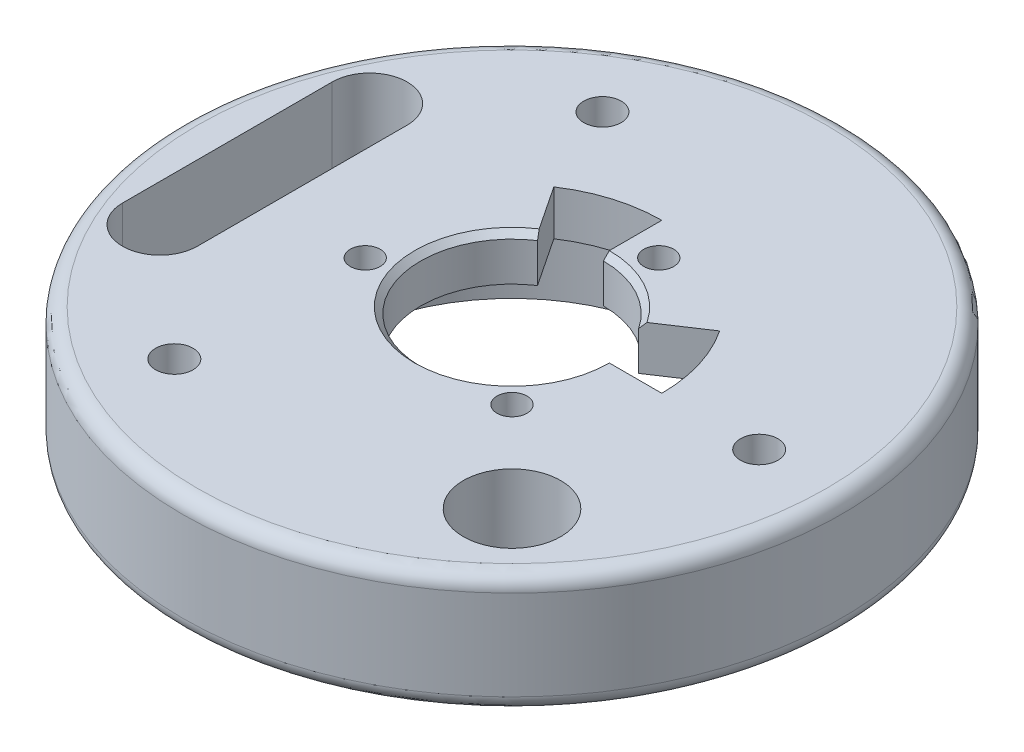
ISO-10303-21;
HEADER;
FILE_DESCRIPTION(('STEP AP214'),'2;1');
FILE_NAME('part.step','',(''),(''),'','','');
FILE_SCHEMA(('AUTOMOTIVE_DESIGN { 1 0 10303 214 1 1 1 1 }'));
ENDSEC;
DATA;
#1=APPLICATION_CONTEXT('core data for automotive mechanical design processes');
#2=APPLICATION_PROTOCOL_DEFINITION('international standard','automotive_design',2000,#1);
#3=PRODUCT_CONTEXT('',#1,'mechanical');
#4=PRODUCT('Part','Part','',(#3));
#5=PRODUCT_RELATED_PRODUCT_CATEGORY('part','',(#4));
#6=PRODUCT_DEFINITION_FORMATION('','',#4);
#7=PRODUCT_DEFINITION_CONTEXT('part definition',#1,'design');
#8=PRODUCT_DEFINITION('design','',#6,#7);
#9=PRODUCT_DEFINITION_SHAPE('','',#8);
#10=(LENGTH_UNIT() NAMED_UNIT(*) SI_UNIT(.MILLI.,.METRE.));
#11=(NAMED_UNIT(*) PLANE_ANGLE_UNIT() SI_UNIT($,.RADIAN.));
#12=(NAMED_UNIT(*) SI_UNIT($,.STERADIAN.) SOLID_ANGLE_UNIT());
#13=UNCERTAINTY_MEASURE_WITH_UNIT(LENGTH_MEASURE(1.E-05),#10,'distance_accuracy_value','');
#14=(GEOMETRIC_REPRESENTATION_CONTEXT(3) GLOBAL_UNCERTAINTY_ASSIGNED_CONTEXT((#13)) GLOBAL_UNIT_ASSIGNED_CONTEXT((#10,
#11,#12)) REPRESENTATION_CONTEXT('',''));
#15=CARTESIAN_POINT('',(0.,0.,0.));
#16=DIRECTION('',(0.,0.,1.));
#17=DIRECTION('',(1.,0.,0.));
#18=AXIS2_PLACEMENT_3D('',#15,#16,#17);
#19=CARTESIAN_POINT('',(0.,0.,0.));
#20=DIRECTION('',(0.,-1.,0.));
#21=DIRECTION('',(0.,0.,-1.));
#22=AXIS2_PLACEMENT_3D('',#19,#20,#21);
#23=CYLINDRICAL_SURFACE('',#22,6.1);
#24=DIRECTION('',(0.,-1.,0.));
#25=VECTOR('',#24,1.);
#26=CARTESIAN_POINT('',(-3.37687435209586,0.,-5.08003145759523));
#27=LINE('',#26,#25);
#28=CARTESIAN_POINT('',(-3.37687435209586,7.60000000000001,-5.08003145759523));
#29=VERTEX_POINT('',#28);
#30=CARTESIAN_POINT('',(-3.37687435209586,5.,-5.08003145759523));
#31=VERTEX_POINT('',#30);
#32=EDGE_CURVE('E164',#29,#31,#27,.T.);
#33=ORIENTED_EDGE('',*,*,#32,.F.);
#34=CARTESIAN_POINT('',(0.,7.60000000000001,0.));
#35=DIRECTION('',(0.,1.,0.));
#36=DIRECTION('',(0.,0.,1.));
#37=AXIS2_PLACEMENT_3D('',#34,#35,#36);
#38=CIRCLE('',#37,6.1);
#39=CARTESIAN_POINT('',(6.1,7.60000000000001,0.));
#40=VERTEX_POINT('',#39);
#41=EDGE_CURVE('E278',#29,#40,#38,.T.);
#42=ORIENTED_EDGE('',*,*,#41,.T.);
#43=DIRECTION('',(0.,-1.,0.));
#44=VECTOR('',#43,1.);
#45=CARTESIAN_POINT('',(6.1,0.,0.));
#46=LINE('',#45,#44);
#47=CARTESIAN_POINT('',(6.1,5.,0.));
#48=VERTEX_POINT('',#47);
#49=EDGE_CURVE('E242',#48,#40,#46,.F.);
#50=ORIENTED_EDGE('',*,*,#49,.F.);
#51=CARTESIAN_POINT('',(0.,5.,0.));
#52=DIRECTION('',(0.,-1.,0.));
#53=DIRECTION('',(0.,0.,-1.));
#54=AXIS2_PLACEMENT_3D('',#51,#52,#53);
#55=CIRCLE('',#54,6.1);
#56=EDGE_CURVE('E260',#48,#31,#55,.T.);
#57=ORIENTED_EDGE('',*,*,#56,.T.);
#58=EDGE_LOOP('',(#33,#42,#50,#57));
#59=FACE_BOUND('',#58,.T.);
#60=ADVANCED_FACE('F33',(#59),#23,.F.);
#61=CARTESIAN_POINT('',(0.,8.,0.));
#62=DIRECTION('',(0.,1.,0.));
#63=DIRECTION('',(0.,0.,1.));
#64=AXIS2_PLACEMENT_3D('',#61,#62,#63);
#65=CONICAL_SURFACE('',#64,6.49999999999999,0.785398163397455);
#66=DIRECTION('',(0.391444385833103,-0.707106781186543,0.58887290037813));
#67=VECTOR('',#66,1.);
#68=CARTESIAN_POINT('',(0.,1.50000000000009,0.));
#69=LINE('',#68,#67);
#70=CARTESIAN_POINT('',(-3.59830873583985,8.,-5.41314827448672));
#71=VERTEX_POINT('',#70);
#72=EDGE_CURVE('E41',#71,#29,#69,.T.);
#73=ORIENTED_EDGE('',*,*,#72,.F.);
#74=CARTESIAN_POINT('',(0.,8.,0.));
#75=DIRECTION('',(0.,1.,0.));
#76=DIRECTION('',(0.,0.,1.));
#77=AXIS2_PLACEMENT_3D('',#74,#75,#76);
#78=CIRCLE('',#77,6.49999999999999);
#79=CARTESIAN_POINT('',(6.49999999999999,8.,0.));
#80=VERTEX_POINT('',#79);
#81=EDGE_CURVE('E276',#80,#71,#78,.F.);
#82=ORIENTED_EDGE('',*,*,#81,.F.);
#83=DIRECTION('',(0.707106781186552,0.707106781186543,0.));
#84=VECTOR('',#83,1.);
#85=CARTESIAN_POINT('',(0.,1.50000000000009,0.));
#86=LINE('',#85,#84);
#87=EDGE_CURVE('E284',#40,#80,#86,.T.);
#88=ORIENTED_EDGE('',*,*,#87,.F.);
#89=ORIENTED_EDGE('',*,*,#41,.F.);
#90=EDGE_LOOP('',(#73,#82,#88,#89));
#91=FACE_BOUND('',#90,.T.);
#92=ADVANCED_FACE('F306',(#91),#65,.F.);
#93=CARTESIAN_POINT('',(12.,0.,0.));
#94=DIRECTION('',(0.,-1.,0.));
#95=DIRECTION('',(0.,0.,-1.));
#96=AXIS2_PLACEMENT_3D('',#93,#94,#95);
#97=PLANE('',#96);
#98=CARTESIAN_POINT('',(11.667261889578,0.,11.6672618895781));
#99=DIRECTION('',(0.,-1.,0.));
#100=DIRECTION('',(0.,0.,-1.));
#101=AXIS2_PLACEMENT_3D('',#98,#99,#100);
#102=CIRCLE('',#101,3.25);
#103=CARTESIAN_POINT('',(11.667261889578,0.,8.41726188957805));
#104=VERTEX_POINT('',#103);
#105=EDGE_CURVE('E151',#104,#104,#102,.T.);
#106=ORIENTED_EDGE('',*,*,#105,.F.);
#107=EDGE_LOOP('',(#106));
#108=FACE_BOUND('',#107,.T.);
#109=CARTESIAN_POINT('',(-16.5,0.,-7.00000000000012));
#110=DIRECTION('',(0.,-1.,0.));
#111=DIRECTION('',(0.,0.,-1.));
#112=AXIS2_PLACEMENT_3D('',#109,#110,#111);
#113=CIRCLE('',#112,2.5);
#114=CARTESIAN_POINT('',(-19.,0.,-7.00000000000012));
#115=VERTEX_POINT('',#114);
#116=CARTESIAN_POINT('',(-14.,0.,-7.00000000000015));
#117=VERTEX_POINT('',#116);
#118=EDGE_CURVE('E192',#115,#117,#113,.T.);
#119=ORIENTED_EDGE('',*,*,#118,.F.);
#120=DIRECTION('',(0.,0.,-1.));
#121=VECTOR('',#120,1.);
#122=CARTESIAN_POINT('',(-19.,0.,0.));
#123=LINE('',#122,#121);
#124=CARTESIAN_POINT('',(-19.,0.,7.00000000000012));
#125=VERTEX_POINT('',#124);
#126=EDGE_CURVE('E181',#125,#115,#123,.T.);
#127=ORIENTED_EDGE('',*,*,#126,.F.);
#128=CARTESIAN_POINT('',(-16.5,0.,7.00000000000012));
#129=DIRECTION('',(0.,-1.,0.));
#130=DIRECTION('',(0.,0.,-1.));
#131=AXIS2_PLACEMENT_3D('',#128,#129,#130);
#132=CIRCLE('',#131,2.5);
#133=CARTESIAN_POINT('',(-14.,0.,7.00000000000015));
#134=VERTEX_POINT('',#133);
#135=EDGE_CURVE('E188',#134,#125,#132,.T.);
#136=ORIENTED_EDGE('',*,*,#135,.F.);
#137=DIRECTION('',(0.,0.,1.));
#138=VECTOR('',#137,1.);
#139=CARTESIAN_POINT('',(-14.,0.,0.));
#140=LINE('',#139,#138);
#141=EDGE_CURVE('E190',#117,#134,#140,.T.);
#142=ORIENTED_EDGE('',*,*,#141,.F.);
#143=EDGE_LOOP('',(#119,#127,#136,#142));
#144=FACE_BOUND('',#143,.T.);
#145=CARTESIAN_POINT('',(-8.25,0.,-14.2894191624432));
#146=DIRECTION('',(0.,-1.,0.));
#147=DIRECTION('',(0.,0.,-1.));
#148=AXIS2_PLACEMENT_3D('',#145,#146,#147);
#149=CIRCLE('',#148,1.25);
#150=CARTESIAN_POINT('',(-8.25,0.,-15.5394191624432));
#151=VERTEX_POINT('',#150);
#152=EDGE_CURVE('E197',#151,#151,#149,.T.);
#153=ORIENTED_EDGE('',*,*,#152,.F.);
#154=EDGE_LOOP('',(#153));
#155=FACE_BOUND('',#154,.T.);
#156=CARTESIAN_POINT('',(-8.24999999999999,0.,14.2894191624432));
#157=DIRECTION('',(0.,-1.,0.));
#158=DIRECTION('',(0.,0.,-1.));
#159=AXIS2_PLACEMENT_3D('',#156,#157,#158);
#160=CIRCLE('',#159,1.25);
#161=CARTESIAN_POINT('',(-8.24999999999999,0.,13.0394191624432));
#162=VERTEX_POINT('',#161);
#163=EDGE_CURVE('E203',#162,#162,#160,.T.);
#164=ORIENTED_EDGE('',*,*,#163,.F.);
#165=EDGE_LOOP('',(#164));
#166=FACE_BOUND('',#165,.T.);
#167=CARTESIAN_POINT('',(16.5,0.,0.));
#168=DIRECTION('',(0.,-1.,0.));
#169=DIRECTION('',(0.,0.,-1.));
#170=AXIS2_PLACEMENT_3D('',#167,#168,#169);
#171=CIRCLE('',#170,1.25000000000001);
#172=CARTESIAN_POINT('',(16.5,0.,-1.25000000000001));
#173=VERTEX_POINT('',#172);
#174=EDGE_CURVE('E217',#173,#173,#171,.T.);
#175=ORIENTED_EDGE('',*,*,#174,.F.);
#176=EDGE_LOOP('',(#175));
#177=FACE_BOUND('',#176,.T.);
#178=CARTESIAN_POINT('',(0.,0.,0.));
#179=DIRECTION('',(0.,-1.,0.));
#180=DIRECTION('',(0.,0.,-1.));
#181=AXIS2_PLACEMENT_3D('',#178,#179,#180);
#182=CIRCLE('',#181,21.);
#183=CARTESIAN_POINT('',(0.,0.,-21.));
#184=VERTEX_POINT('',#183);
#185=EDGE_CURVE('E263',#184,#184,#182,.T.);
#186=ORIENTED_EDGE('',*,*,#185,.T.);
#187=EDGE_LOOP('',(#186));
#188=FACE_BOUND('',#187,.T.);
#189=CARTESIAN_POINT('',(0.,0.,0.));
#190=DIRECTION('',(0.,-1.,0.));
#191=DIRECTION('',(0.,0.,-1.));
#192=AXIS2_PLACEMENT_3D('',#189,#190,#191);
#193=CIRCLE('',#192,12.);
#194=CARTESIAN_POINT('',(0.,0.,-12.));
#195=VERTEX_POINT('',#194);
#196=EDGE_CURVE('E247',#195,#195,#193,.T.);
#197=ORIENTED_EDGE('',*,*,#196,.F.);
#198=EDGE_LOOP('',(#197));
#199=FACE_BOUND('',#198,.T.);
#200=ADVANCED_FACE('F346',(#108,#144,#155,#166,#177,#188,#199),#97,.T.);
#201=CARTESIAN_POINT('',(0.,0.,0.));
#202=DIRECTION('',(0.,-1.,0.));
#203=DIRECTION('',(0.,0.,-1.));
#204=AXIS2_PLACEMENT_3D('',#201,#202,#203);
#205=CYLINDRICAL_SURFACE('',#204,22.);
#206=CARTESIAN_POINT('',(0.,1.,0.));
#207=DIRECTION('',(0.,-1.,0.));
#208=DIRECTION('',(0.,0.,-1.));
#209=AXIS2_PLACEMENT_3D('',#206,#207,#208);
#210=CIRCLE('',#209,22.);
#211=CARTESIAN_POINT('',(0.,1.,-22.));
#212=VERTEX_POINT('',#211);
#213=EDGE_CURVE('E269',#212,#212,#210,.F.);
#214=ORIENTED_EDGE('',*,*,#213,.T.);
#215=EDGE_LOOP('',(#214));
#216=FACE_BOUND('',#215,.T.);
#217=CARTESIAN_POINT('',(0.,7.,0.));
#218=DIRECTION('',(0.,1.,0.));
#219=DIRECTION('',(0.,0.,1.));
#220=AXIS2_PLACEMENT_3D('',#217,#218,#219);
#221=CIRCLE('',#220,22.);
#222=CARTESIAN_POINT('',(0.,7.,22.));
#223=VERTEX_POINT('',#222);
#224=EDGE_CURVE('E266',#223,#223,#221,.F.);
#225=ORIENTED_EDGE('',*,*,#224,.T.);
#226=EDGE_LOOP('',(#225));
#227=FACE_BOUND('',#226,.T.);
#228=ADVANCED_FACE('F355',(#216,#227),#205,.T.);
#229=CARTESIAN_POINT('',(6.1,8.,0.));
#230=DIRECTION('',(0.,1.,0.));
#231=DIRECTION('',(0.,0.,1.));
#232=AXIS2_PLACEMENT_3D('',#229,#230,#231);
#233=PLANE('',#232);
#234=CARTESIAN_POINT('',(11.667261889578,8.,11.6672618895781));
#235=DIRECTION('',(0.,1.,0.));
#236=DIRECTION('',(0.,0.,1.));
#237=AXIS2_PLACEMENT_3D('',#234,#235,#236);
#238=CIRCLE('',#237,3.25);
#239=CARTESIAN_POINT('',(11.667261889578,8.,14.917261889578));
#240=VERTEX_POINT('',#239);
#241=EDGE_CURVE('E539',#240,#240,#238,.T.);
#242=ORIENTED_EDGE('',*,*,#241,.F.);
#243=EDGE_LOOP('',(#242));
#244=FACE_BOUND('',#243,.T.);
#245=DIRECTION('',(0.553585959359977,0.,0.832792042228727));
#246=VECTOR('',#245,1.);
#247=CARTESIAN_POINT('',(-5.53585959359977,8.,-8.32792042228727));
#248=LINE('',#247,#246);
#249=CARTESIAN_POINT('',(-5.53585959359977,8.,-8.32792042228727));
#250=VERTEX_POINT('',#249);
#251=EDGE_CURVE('E143',#250,#71,#248,.T.);
#252=ORIENTED_EDGE('',*,*,#251,.F.);
#253=CARTESIAN_POINT('',(0.,8.,0.));
#254=DIRECTION('',(0.,1.,0.));
#255=DIRECTION('',(0.,0.,1.));
#256=AXIS2_PLACEMENT_3D('',#253,#254,#255);
#257=CIRCLE('',#256,10.);
#258=CARTESIAN_POINT('',(1.04744440165294E-13,8.,-10.));
#259=VERTEX_POINT('',#258);
#260=EDGE_CURVE('E138',#259,#250,#257,.T.);
#261=ORIENTED_EDGE('',*,*,#260,.F.);
#262=DIRECTION('',(0.,0.,-1.));
#263=VECTOR('',#262,1.);
#264=CARTESIAN_POINT('',(1.04744440165294E-13,8.,-10.));
#265=LINE('',#264,#263);
#266=CARTESIAN_POINT('',(0.,8.,-6.49999999999999));
#267=VERTEX_POINT('',#266);
#268=EDGE_CURVE('E146',#267,#259,#265,.T.);
#269=ORIENTED_EDGE('',*,*,#268,.F.);
#270=CARTESIAN_POINT('',(5.41314827448668,8.,-3.5983087358399));
#271=VERTEX_POINT('',#270);
#272=EDGE_CURVE('E275',#267,#271,#78,.F.);
#273=ORIENTED_EDGE('',*,*,#272,.T.);
#274=DIRECTION('',(-0.832792042228721,0.,0.553585959359986));
#275=VECTOR('',#274,1.);
#276=CARTESIAN_POINT('',(0.,8.,0.));
#277=LINE('',#276,#275);
#278=CARTESIAN_POINT('',(8.32792042228721,8.,-5.53585959359986));
#279=VERTEX_POINT('',#278);
#280=EDGE_CURVE('E230',#279,#271,#277,.T.);
#281=ORIENTED_EDGE('',*,*,#280,.F.);
#282=CARTESIAN_POINT('',(0.,8.,0.));
#283=DIRECTION('',(0.,1.,0.));
#284=DIRECTION('',(0.,0.,1.));
#285=AXIS2_PLACEMENT_3D('',#282,#283,#284);
#286=CIRCLE('',#285,10.);
#287=CARTESIAN_POINT('',(10.,8.,0.));
#288=VERTEX_POINT('',#287);
#289=EDGE_CURVE('E227',#288,#279,#286,.T.);
#290=ORIENTED_EDGE('',*,*,#289,.F.);
#291=DIRECTION('',(1.,0.,0.));
#292=VECTOR('',#291,1.);
#293=CARTESIAN_POINT('',(0.,8.,0.));
#294=LINE('',#293,#292);
#295=EDGE_CURVE('E224',#80,#288,#294,.T.);
#296=ORIENTED_EDGE('',*,*,#295,.F.);
#297=ORIENTED_EDGE('',*,*,#81,.T.);
#298=EDGE_LOOP('',(#252,#261,#269,#273,#281,#290,#296,#297));
#299=FACE_BOUND('',#298,.T.);
#300=CARTESIAN_POINT('',(-16.5,8.,-7.00000000000012));
#301=DIRECTION('',(0.,1.,0.));
#302=DIRECTION('',(0.,0.,-1.));
#303=AXIS2_PLACEMENT_3D('',#300,#301,#302);
#304=CIRCLE('',#303,2.5);
#305=CARTESIAN_POINT('',(-14.,8.,-7.00000000000015));
#306=VERTEX_POINT('',#305);
#307=CARTESIAN_POINT('',(-19.,8.,-7.00000000000012));
#308=VERTEX_POINT('',#307);
#309=EDGE_CURVE('E168',#306,#308,#304,.T.);
#310=ORIENTED_EDGE('',*,*,#309,.F.);
#311=DIRECTION('',(0.,0.,-1.));
#312=VECTOR('',#311,1.);
#313=CARTESIAN_POINT('',(-14.,8.,-7.00000000000015));
#314=LINE('',#313,#312);
#315=CARTESIAN_POINT('',(-14.,8.,7.00000000000015));
#316=VERTEX_POINT('',#315);
#317=EDGE_CURVE('E175',#316,#306,#314,.T.);
#318=ORIENTED_EDGE('',*,*,#317,.F.);
#319=CARTESIAN_POINT('',(-16.5,8.,7.00000000000012));
#320=DIRECTION('',(0.,1.,0.));
#321=DIRECTION('',(0.,0.,1.));
#322=AXIS2_PLACEMENT_3D('',#319,#320,#321);
#323=CIRCLE('',#322,2.5);
#324=CARTESIAN_POINT('',(-19.,8.,7.00000000000012));
#325=VERTEX_POINT('',#324);
#326=EDGE_CURVE('E172',#325,#316,#323,.T.);
#327=ORIENTED_EDGE('',*,*,#326,.F.);
#328=DIRECTION('',(0.,0.,1.));
#329=VECTOR('',#328,1.);
#330=CARTESIAN_POINT('',(-19.,8.,-7.00000000000012));
#331=LINE('',#330,#329);
#332=EDGE_CURVE('E170',#308,#325,#331,.T.);
#333=ORIENTED_EDGE('',*,*,#332,.F.);
#334=EDGE_LOOP('',(#310,#318,#327,#333));
#335=FACE_BOUND('',#334,.T.);
#336=CARTESIAN_POINT('',(-8.25,8.,-14.2894191624432));
#337=DIRECTION('',(0.,1.,0.));
#338=DIRECTION('',(0.,0.,1.));
#339=AXIS2_PLACEMENT_3D('',#336,#337,#338);
#340=CIRCLE('',#339,1.25);
#341=CARTESIAN_POINT('',(-8.25,8.,-13.0394191624432));
#342=VERTEX_POINT('',#341);
#343=EDGE_CURVE('E194',#342,#342,#340,.T.);
#344=ORIENTED_EDGE('',*,*,#343,.F.);
#345=EDGE_LOOP('',(#344));
#346=FACE_BOUND('',#345,.T.);
#347=CARTESIAN_POINT('',(-8.24999999999999,8.,14.2894191624432));
#348=DIRECTION('',(0.,1.,0.));
#349=DIRECTION('',(0.,0.,1.));
#350=AXIS2_PLACEMENT_3D('',#347,#348,#349);
#351=CIRCLE('',#350,1.25);
#352=CARTESIAN_POINT('',(-8.24999999999999,8.,15.5394191624432));
#353=VERTEX_POINT('',#352);
#354=EDGE_CURVE('E200',#353,#353,#351,.T.);
#355=ORIENTED_EDGE('',*,*,#354,.F.);
#356=EDGE_LOOP('',(#355));
#357=FACE_BOUND('',#356,.T.);
#358=CARTESIAN_POINT('',(-7.72740661031212,8.,2.07055236082062));
#359=DIRECTION('',(0.,1.,0.));
#360=DIRECTION('',(0.,0.,1.));
#361=AXIS2_PLACEMENT_3D('',#358,#359,#360);
#362=CIRCLE('',#361,1.);
#363=CARTESIAN_POINT('',(-7.72740661031212,8.,3.07055236082062));
#364=VERTEX_POINT('',#363);
#365=EDGE_CURVE('E206',#364,#364,#362,.T.);
#366=ORIENTED_EDGE('',*,*,#365,.F.);
#367=EDGE_LOOP('',(#366));
#368=FACE_BOUND('',#367,.T.);
#369=CARTESIAN_POINT('',(5.65685424949298,8.,5.65685424949221));
#370=DIRECTION('',(0.,1.,0.));
#371=DIRECTION('',(0.,0.,1.));
#372=AXIS2_PLACEMENT_3D('',#369,#370,#371);
#373=CIRCLE('',#372,1.);
#374=CARTESIAN_POINT('',(5.65685424949298,8.,6.65685424949221));
#375=VERTEX_POINT('',#374);
#376=EDGE_CURVE('E210',#375,#375,#373,.T.);
#377=ORIENTED_EDGE('',*,*,#376,.F.);
#378=EDGE_LOOP('',(#377));
#379=FACE_BOUND('',#378,.T.);
#380=CARTESIAN_POINT('',(16.5,8.,0.));
#381=DIRECTION('',(0.,1.,0.));
#382=DIRECTION('',(0.,0.,1.));
#383=AXIS2_PLACEMENT_3D('',#380,#381,#382);
#384=CIRCLE('',#383,1.25000000000001);
#385=CARTESIAN_POINT('',(16.5,8.,1.25000000000001));
#386=VERTEX_POINT('',#385);
#387=EDGE_CURVE('E214',#386,#386,#384,.T.);
#388=ORIENTED_EDGE('',*,*,#387,.F.);
#389=EDGE_LOOP('',(#388));
#390=FACE_BOUND('',#389,.T.);
#391=CARTESIAN_POINT('',(2.07055236082014,8.,-7.72740661031255));
#392=DIRECTION('',(0.,1.,0.));
#393=DIRECTION('',(0.,0.,1.));
#394=AXIS2_PLACEMENT_3D('',#391,#392,#393);
#395=CIRCLE('',#394,1.);
#396=CARTESIAN_POINT('',(2.07055236082014,8.,-6.72740661031255));
#397=VERTEX_POINT('',#396);
#398=EDGE_CURVE('E220',#397,#397,#395,.T.);
#399=ORIENTED_EDGE('',*,*,#398,.F.);
#400=EDGE_LOOP('',(#399));
#401=FACE_BOUND('',#400,.T.);
#402=CARTESIAN_POINT('',(0.,8.,0.));
#403=DIRECTION('',(0.,1.,0.));
#404=DIRECTION('',(0.,0.,1.));
#405=AXIS2_PLACEMENT_3D('',#402,#403,#404);
#406=CIRCLE('',#405,21.);
#407=CARTESIAN_POINT('',(0.,8.,21.));
#408=VERTEX_POINT('',#407);
#409=EDGE_CURVE('E272',#408,#408,#406,.T.);
#410=ORIENTED_EDGE('',*,*,#409,.T.);
#411=EDGE_LOOP('',(#410));
#412=FACE_BOUND('',#411,.T.);
#413=ADVANCED_FACE('F153',(#244,#299,#335,#346,#357,#368,#379,#390,#401,#412),#233,.T.);
#414=DIRECTION('',(0.,-1.,0.));
#415=VECTOR('',#414,1.);
#416=CARTESIAN_POINT('',(0.,0.,-6.1));
#417=LINE('',#416,#415);
#418=CARTESIAN_POINT('',(0.,5.,-6.1));
#419=VERTEX_POINT('',#418);
#420=CARTESIAN_POINT('',(0.,7.60000000000001,-6.1));
#421=VERTEX_POINT('',#420);
#422=EDGE_CURVE('E48',#419,#421,#417,.F.);
#423=ORIENTED_EDGE('',*,*,#422,.F.);
#424=CARTESIAN_POINT('',(5.0800314575952,5.,-3.37687435209591));
#425=VERTEX_POINT('',#424);
#426=EDGE_CURVE('E259',#419,#425,#55,.T.);
#427=ORIENTED_EDGE('',*,*,#426,.T.);
#428=DIRECTION('',(0.,-1.,0.));
#429=VECTOR('',#428,1.);
#430=CARTESIAN_POINT('',(5.0800314575952,0.,-3.37687435209591));
#431=LINE('',#430,#429);
#432=CARTESIAN_POINT('',(5.0800314575952,7.60000000000001,-3.37687435209591));
#433=VERTEX_POINT('',#432);
#434=EDGE_CURVE('E236',#433,#425,#431,.T.);
#435=ORIENTED_EDGE('',*,*,#434,.F.);
#436=EDGE_CURVE('E279',#433,#421,#38,.T.);
#437=ORIENTED_EDGE('',*,*,#436,.T.);
#438=EDGE_LOOP('',(#423,#427,#435,#437));
#439=FACE_BOUND('',#438,.T.);
#440=ADVANCED_FACE('F324',(#439),#23,.F.);
#441=CARTESIAN_POINT('',(13.,5.,0.));
#442=DIRECTION('',(0.,-1.,0.));
#443=DIRECTION('',(0.,0.,-1.));
#444=AXIS2_PLACEMENT_3D('',#441,#442,#443);
#445=PLANE('',#444);
#446=DIRECTION('',(-0.553585959359977,0.,-0.832792042228727));
#447=VECTOR('',#446,1.);
#448=CARTESIAN_POINT('',(3.98394638720658,5.,5.99328576137908));
#449=LINE('',#448,#447);
#450=CARTESIAN_POINT('',(-5.53585959359977,5.,-8.32792042228727));
#451=VERTEX_POINT('',#450);
#452=EDGE_CURVE('E166',#31,#451,#449,.T.);
#453=ORIENTED_EDGE('',*,*,#452,.F.);
#454=ORIENTED_EDGE('',*,*,#56,.F.);
#455=DIRECTION('',(-1.,0.,0.));
#456=VECTOR('',#455,1.);
#457=CARTESIAN_POINT('',(13.,5.,0.));
#458=LINE('',#457,#456);
#459=CARTESIAN_POINT('',(10.,5.,0.));
#460=VERTEX_POINT('',#459);
#461=EDGE_CURVE('E245',#460,#48,#458,.T.);
#462=ORIENTED_EDGE('',*,*,#461,.F.);
#463=CARTESIAN_POINT('',(0.,5.,0.));
#464=DIRECTION('',(0.,-1.,0.));
#465=DIRECTION('',(0.,0.,-1.));
#466=AXIS2_PLACEMENT_3D('',#463,#464,#465);
#467=CIRCLE('',#466,10.);
#468=CARTESIAN_POINT('',(8.32792042228721,5.,-5.53585959359986));
#469=VERTEX_POINT('',#468);
#470=EDGE_CURVE('E286',#469,#460,#467,.T.);
#471=ORIENTED_EDGE('',*,*,#470,.F.);
#472=DIRECTION('',(0.832792042228721,0.,-0.553585959359986));
#473=VECTOR('',#472,1.);
#474=CARTESIAN_POINT('',(9.0160536127933,5.,-5.99328576137913));
#475=LINE('',#474,#473);
#476=EDGE_CURVE('E240',#425,#469,#475,.T.);
#477=ORIENTED_EDGE('',*,*,#476,.F.);
#478=ORIENTED_EDGE('',*,*,#426,.F.);
#479=DIRECTION('',(0.,0.,1.));
#480=VECTOR('',#479,1.);
#481=CARTESIAN_POINT('',(0.,5.,-1.36168593366334E-13));
#482=LINE('',#481,#480);
#483=CARTESIAN_POINT('',(1.04744440165294E-13,5.,-10.));
#484=VERTEX_POINT('',#483);
#485=EDGE_CURVE('E162',#484,#419,#482,.T.);
#486=ORIENTED_EDGE('',*,*,#485,.F.);
#487=CARTESIAN_POINT('',(0.,5.,0.));
#488=DIRECTION('',(0.,-1.,0.));
#489=DIRECTION('',(0.,0.,-1.));
#490=AXIS2_PLACEMENT_3D('',#487,#488,#489);
#491=CIRCLE('',#490,10.);
#492=EDGE_CURVE('E11',#451,#484,#491,.T.);
#493=ORIENTED_EDGE('',*,*,#492,.F.);
#494=EDGE_LOOP('',(#453,#454,#462,#471,#477,#478,#486,#493));
#495=FACE_BOUND('',#494,.T.);
#496=CARTESIAN_POINT('',(-7.72740661031212,5.,2.07055236082062));
#497=DIRECTION('',(0.,-1.,0.));
#498=DIRECTION('',(0.,0.,-1.));
#499=AXIS2_PLACEMENT_3D('',#496,#497,#498);
#500=CIRCLE('',#499,1.);
#501=CARTESIAN_POINT('',(-7.72740661031212,5.,1.07055236082062));
#502=VERTEX_POINT('',#501);
#503=EDGE_CURVE('E209',#502,#502,#500,.T.);
#504=ORIENTED_EDGE('',*,*,#503,.F.);
#505=EDGE_LOOP('',(#504));
#506=FACE_BOUND('',#505,.T.);
#507=CARTESIAN_POINT('',(5.65685424949298,5.,5.65685424949221));
#508=DIRECTION('',(0.,-1.,0.));
#509=DIRECTION('',(0.,0.,-1.));
#510=AXIS2_PLACEMENT_3D('',#507,#508,#509);
#511=CIRCLE('',#510,1.);
#512=CARTESIAN_POINT('',(5.65685424949298,5.,4.6568542494922));
#513=VERTEX_POINT('',#512);
#514=EDGE_CURVE('E213',#513,#513,#511,.T.);
#515=ORIENTED_EDGE('',*,*,#514,.F.);
#516=EDGE_LOOP('',(#515));
#517=FACE_BOUND('',#516,.T.);
#518=CARTESIAN_POINT('',(2.07055236082014,5.,-7.72740661031255));
#519=DIRECTION('',(0.,-1.,0.));
#520=DIRECTION('',(0.,0.,-1.));
#521=AXIS2_PLACEMENT_3D('',#518,#519,#520);
#522=CIRCLE('',#521,1.);
#523=CARTESIAN_POINT('',(2.07055236082014,5.,-8.72740661031255));
#524=VERTEX_POINT('',#523);
#525=EDGE_CURVE('E223',#524,#524,#522,.T.);
#526=ORIENTED_EDGE('',*,*,#525,.F.);
#527=EDGE_LOOP('',(#526));
#528=FACE_BOUND('',#527,.T.);
#529=CARTESIAN_POINT('',(0.,5.,0.));
#530=DIRECTION('',(0.,-1.,0.));
#531=DIRECTION('',(0.,0.,-1.));
#532=AXIS2_PLACEMENT_3D('',#529,#530,#531);
#533=CIRCLE('',#532,13.);
#534=CARTESIAN_POINT('',(0.,5.,-13.));
#535=VERTEX_POINT('',#534);
#536=EDGE_CURVE('E256',#535,#535,#533,.T.);
#537=ORIENTED_EDGE('',*,*,#536,.T.);
#538=EDGE_LOOP('',(#537));
#539=FACE_BOUND('',#538,.T.);
#540=ADVANCED_FACE('F319',(#495,#506,#517,#528,#539),#445,.T.);
#541=CARTESIAN_POINT('',(0.,0.,0.));
#542=DIRECTION('',(0.,-1.,0.));
#543=DIRECTION('',(0.,0.,-1.));
#544=AXIS2_PLACEMENT_3D('',#541,#542,#543);
#545=CYLINDRICAL_SURFACE('',#544,13.);
#546=CARTESIAN_POINT('',(0.,4.,0.));
#547=DIRECTION('',(0.,-1.,0.));
#548=DIRECTION('',(0.,0.,-1.));
#549=AXIS2_PLACEMENT_3D('',#546,#547,#548);
#550=CIRCLE('',#549,13.);
#551=CARTESIAN_POINT('',(0.,4.,-13.));
#552=VERTEX_POINT('',#551);
#553=EDGE_CURVE('E253',#552,#552,#550,.T.);
#554=ORIENTED_EDGE('',*,*,#553,.T.);
#555=EDGE_LOOP('',(#554));
#556=FACE_BOUND('',#555,.T.);
#557=ORIENTED_EDGE('',*,*,#536,.F.);
#558=EDGE_LOOP('',(#557));
#559=FACE_BOUND('',#558,.T.);
#560=ADVANCED_FACE('F354',(#556,#559),#545,.F.);
#561=CARTESIAN_POINT('',(12.,4.,0.));
#562=DIRECTION('',(0.,1.,0.));
#563=DIRECTION('',(0.,0.,1.));
#564=AXIS2_PLACEMENT_3D('',#561,#562,#563);
#565=PLANE('',#564);
#566=CARTESIAN_POINT('',(0.,4.,0.));
#567=DIRECTION('',(0.,-1.,0.));
#568=DIRECTION('',(0.,0.,-1.));
#569=AXIS2_PLACEMENT_3D('',#566,#567,#568);
#570=CIRCLE('',#569,12.);
#571=CARTESIAN_POINT('',(0.,4.,-12.));
#572=VERTEX_POINT('',#571);
#573=EDGE_CURVE('E250',#572,#572,#570,.T.);
#574=ORIENTED_EDGE('',*,*,#573,.T.);
#575=EDGE_LOOP('',(#574));
#576=FACE_BOUND('',#575,.T.);
#577=ORIENTED_EDGE('',*,*,#553,.F.);
#578=EDGE_LOOP('',(#577));
#579=FACE_BOUND('',#578,.T.);
#580=ADVANCED_FACE('F558',(#576,#579),#565,.T.);
#581=CARTESIAN_POINT('',(0.,0.,0.));
#582=DIRECTION('',(0.,-1.,0.));
#583=DIRECTION('',(0.,0.,-1.));
#584=AXIS2_PLACEMENT_3D('',#581,#582,#583);
#585=CYLINDRICAL_SURFACE('',#584,12.);
#586=ORIENTED_EDGE('',*,*,#196,.T.);
#587=EDGE_LOOP('',(#586));
#588=FACE_BOUND('',#587,.T.);
#589=ORIENTED_EDGE('',*,*,#573,.F.);
#590=EDGE_LOOP('',(#589));
#591=FACE_BOUND('',#590,.T.);
#592=ADVANCED_FACE('F370',(#588,#591),#585,.F.);
#593=CARTESIAN_POINT('',(0.,1.,0.));
#594=DIRECTION('',(0.,-1.,0.));
#595=DIRECTION('',(0.,0.,-1.));
#596=AXIS2_PLACEMENT_3D('',#593,#594,#595);
#597=TOROIDAL_SURFACE('',#596,21.,1.);
#598=ORIENTED_EDGE('',*,*,#213,.F.);
#599=EDGE_LOOP('',(#598));
#600=FACE_BOUND('',#599,.T.);
#601=ORIENTED_EDGE('',*,*,#185,.F.);
#602=EDGE_LOOP('',(#601));
#603=FACE_BOUND('',#602,.T.);
#604=ADVANCED_FACE('F367',(#600,#603),#597,.T.);
#605=CARTESIAN_POINT('',(0.,7.,0.));
#606=DIRECTION('',(0.,1.,0.));
#607=DIRECTION('',(0.,0.,1.));
#608=AXIS2_PLACEMENT_3D('',#605,#606,#607);
#609=TOROIDAL_SURFACE('',#608,21.,1.);
#610=ORIENTED_EDGE('',*,*,#409,.F.);
#611=EDGE_LOOP('',(#610));
#612=FACE_BOUND('',#611,.T.);
#613=ORIENTED_EDGE('',*,*,#224,.F.);
#614=EDGE_LOOP('',(#613));
#615=FACE_BOUND('',#614,.T.);
#616=ADVANCED_FACE('F369',(#612,#615),#609,.T.);
#617=DIRECTION('',(0.,0.707106781186543,-0.707106781186552));
#618=VECTOR('',#617,1.);
#619=CARTESIAN_POINT('',(0.,1.50000000000009,0.));
#620=LINE('',#619,#618);
#621=EDGE_CURVE('E148',#421,#267,#620,.T.);
#622=ORIENTED_EDGE('',*,*,#621,.F.);
#623=ORIENTED_EDGE('',*,*,#436,.F.);
#624=DIRECTION('',(-0.588872900378126,-0.707106781186543,0.391444385833109));
#625=VECTOR('',#624,1.);
#626=CARTESIAN_POINT('',(0.,1.50000000000009,0.));
#627=LINE('',#626,#625);
#628=EDGE_CURVE('E282',#271,#433,#627,.T.);
#629=ORIENTED_EDGE('',*,*,#628,.F.);
#630=ORIENTED_EDGE('',*,*,#272,.F.);
#631=EDGE_LOOP('',(#622,#623,#629,#630));
#632=FACE_BOUND('',#631,.T.);
#633=ADVANCED_FACE('F35',(#632),#65,.F.);
#634=CARTESIAN_POINT('',(0.,-2.,0.));
#635=DIRECTION('',(0.,0.,1.));
#636=DIRECTION('',(1.,0.,0.));
#637=AXIS2_PLACEMENT_3D('',#634,#635,#636);
#638=PLANE('',#637);
#639=ORIENTED_EDGE('',*,*,#461,.T.);
#640=ORIENTED_EDGE('',*,*,#49,.T.);
#641=ORIENTED_EDGE('',*,*,#87,.T.);
#642=ORIENTED_EDGE('',*,*,#295,.T.);
#643=DIRECTION('',(0.,1.,0.));
#644=VECTOR('',#643,1.);
#645=CARTESIAN_POINT('',(10.,-2.,0.));
#646=LINE('',#645,#644);
#647=EDGE_CURVE('E233',#460,#288,#646,.T.);
#648=ORIENTED_EDGE('',*,*,#647,.F.);
#649=EDGE_LOOP('',(#639,#640,#641,#642,#648));
#650=FACE_BOUND('',#649,.T.);
#651=ADVANCED_FACE('F309',(#650),#638,.F.);
#652=CARTESIAN_POINT('',(0.,-2.,0.));
#653=DIRECTION('',(-0.553585959359986,0.,-0.832792042228721));
#654=DIRECTION('',(-0.832792042228721,0.,0.553585959359986));
#655=AXIS2_PLACEMENT_3D('',#652,#653,#654);
#656=PLANE('',#655);
#657=ORIENTED_EDGE('',*,*,#476,.T.);
#658=DIRECTION('',(0.,1.,0.));
#659=VECTOR('',#658,1.);
#660=CARTESIAN_POINT('',(8.32792042228721,-2.,-5.53585959359986));
#661=LINE('',#660,#659);
#662=EDGE_CURVE('E234',#469,#279,#661,.T.);
#663=ORIENTED_EDGE('',*,*,#662,.T.);
#664=ORIENTED_EDGE('',*,*,#280,.T.);
#665=ORIENTED_EDGE('',*,*,#628,.T.);
#666=ORIENTED_EDGE('',*,*,#434,.T.);
#667=EDGE_LOOP('',(#657,#663,#664,#665,#666));
#668=FACE_BOUND('',#667,.T.);
#669=ADVANCED_FACE('F330',(#668),#656,.F.);
#670=CARTESIAN_POINT('',(0.,-2.,0.));
#671=DIRECTION('',(0.,1.,0.));
#672=DIRECTION('',(0.,0.,1.));
#673=AXIS2_PLACEMENT_3D('',#670,#671,#672);
#674=CYLINDRICAL_SURFACE('',#673,10.);
#675=ORIENTED_EDGE('',*,*,#470,.T.);
#676=ORIENTED_EDGE('',*,*,#647,.T.);
#677=ORIENTED_EDGE('',*,*,#289,.T.);
#678=ORIENTED_EDGE('',*,*,#662,.F.);
#679=EDGE_LOOP('',(#675,#676,#677,#678));
#680=FACE_BOUND('',#679,.T.);
#681=ADVANCED_FACE('F315',(#680),#674,.F.);
#682=CARTESIAN_POINT('',(2.07055236082014,-2.,-7.72740661031255));
#683=DIRECTION('',(0.,1.,0.));
#684=DIRECTION('',(0.,0.,1.));
#685=AXIS2_PLACEMENT_3D('',#682,#683,#684);
#686=CYLINDRICAL_SURFACE('',#685,1.);
#687=ORIENTED_EDGE('',*,*,#525,.T.);
#688=EDGE_LOOP('',(#687));
#689=FACE_BOUND('',#688,.T.);
#690=ORIENTED_EDGE('',*,*,#398,.T.);
#691=EDGE_LOOP('',(#690));
#692=FACE_BOUND('',#691,.T.);
#693=ADVANCED_FACE('F337',(#689,#692),#686,.F.);
#694=CARTESIAN_POINT('',(16.5,-2.,0.));
#695=DIRECTION('',(0.,1.,0.));
#696=DIRECTION('',(0.,0.,1.));
#697=AXIS2_PLACEMENT_3D('',#694,#695,#696);
#698=CYLINDRICAL_SURFACE('',#697,1.25000000000001);
#699=ORIENTED_EDGE('',*,*,#174,.T.);
#700=EDGE_LOOP('',(#699));
#701=FACE_BOUND('',#700,.T.);
#702=ORIENTED_EDGE('',*,*,#387,.T.);
#703=EDGE_LOOP('',(#702));
#704=FACE_BOUND('',#703,.T.);
#705=ADVANCED_FACE('F409',(#701,#704),#698,.F.);
#706=CARTESIAN_POINT('',(5.65685424949298,-2.,5.65685424949221));
#707=DIRECTION('',(0.,1.,0.));
#708=DIRECTION('',(0.,0.,1.));
#709=AXIS2_PLACEMENT_3D('',#706,#707,#708);
#710=CYLINDRICAL_SURFACE('',#709,1.);
#711=ORIENTED_EDGE('',*,*,#514,.T.);
#712=EDGE_LOOP('',(#711));
#713=FACE_BOUND('',#712,.T.);
#714=ORIENTED_EDGE('',*,*,#376,.T.);
#715=EDGE_LOOP('',(#714));
#716=FACE_BOUND('',#715,.T.);
#717=ADVANCED_FACE('F418',(#713,#716),#710,.F.);
#718=CARTESIAN_POINT('',(-7.72740661031212,-2.,2.07055236082062));
#719=DIRECTION('',(0.,1.,0.));
#720=DIRECTION('',(0.,0.,1.));
#721=AXIS2_PLACEMENT_3D('',#718,#719,#720);
#722=CYLINDRICAL_SURFACE('',#721,1.);
#723=ORIENTED_EDGE('',*,*,#503,.T.);
#724=EDGE_LOOP('',(#723));
#725=FACE_BOUND('',#724,.T.);
#726=ORIENTED_EDGE('',*,*,#365,.T.);
#727=EDGE_LOOP('',(#726));
#728=FACE_BOUND('',#727,.T.);
#729=ADVANCED_FACE('F428',(#725,#728),#722,.F.);
#730=CARTESIAN_POINT('',(-8.24999999999999,-2.,14.2894191624432));
#731=DIRECTION('',(0.,1.,0.));
#732=DIRECTION('',(0.,0.,1.));
#733=AXIS2_PLACEMENT_3D('',#730,#731,#732);
#734=CYLINDRICAL_SURFACE('',#733,1.25);
#735=ORIENTED_EDGE('',*,*,#163,.T.);
#736=EDGE_LOOP('',(#735));
#737=FACE_BOUND('',#736,.T.);
#738=ORIENTED_EDGE('',*,*,#354,.T.);
#739=EDGE_LOOP('',(#738));
#740=FACE_BOUND('',#739,.T.);
#741=ADVANCED_FACE('F438',(#737,#740),#734,.F.);
#742=CARTESIAN_POINT('',(-8.25,-2.,-14.2894191624432));
#743=DIRECTION('',(0.,1.,0.));
#744=DIRECTION('',(0.,0.,1.));
#745=AXIS2_PLACEMENT_3D('',#742,#743,#744);
#746=CYLINDRICAL_SURFACE('',#745,1.25);
#747=ORIENTED_EDGE('',*,*,#152,.T.);
#748=EDGE_LOOP('',(#747));
#749=FACE_BOUND('',#748,.T.);
#750=ORIENTED_EDGE('',*,*,#343,.T.);
#751=EDGE_LOOP('',(#750));
#752=FACE_BOUND('',#751,.T.);
#753=ADVANCED_FACE('F448',(#749,#752),#746,.F.);
#754=CARTESIAN_POINT('',(-16.5,-2.,-7.00000000000012));
#755=DIRECTION('',(0.,1.,0.));
#756=DIRECTION('',(0.,0.,1.));
#757=AXIS2_PLACEMENT_3D('',#754,#755,#756);
#758=CYLINDRICAL_SURFACE('',#757,2.5);
#759=ORIENTED_EDGE('',*,*,#118,.T.);
#760=DIRECTION('',(0.,1.,0.));
#761=VECTOR('',#760,1.);
#762=CARTESIAN_POINT('',(-14.,-2.,-7.00000000000015));
#763=LINE('',#762,#761);
#764=EDGE_CURVE('E179',#117,#306,#763,.T.);
#765=ORIENTED_EDGE('',*,*,#764,.T.);
#766=ORIENTED_EDGE('',*,*,#309,.T.);
#767=DIRECTION('',(0.,1.,0.));
#768=VECTOR('',#767,1.);
#769=CARTESIAN_POINT('',(-19.,-2.,-7.00000000000012));
#770=LINE('',#769,#768);
#771=EDGE_CURVE('E178',#115,#308,#770,.T.);
#772=ORIENTED_EDGE('',*,*,#771,.F.);
#773=EDGE_LOOP('',(#759,#765,#766,#772));
#774=FACE_BOUND('',#773,.T.);
#775=ADVANCED_FACE('F458',(#774),#758,.F.);
#776=CARTESIAN_POINT('',(-14.,-2.,-7.00000000000015));
#777=DIRECTION('',(1.,0.,0.));
#778=DIRECTION('',(0.,0.,-1.));
#779=AXIS2_PLACEMENT_3D('',#776,#777,#778);
#780=PLANE('',#779);
#781=ORIENTED_EDGE('',*,*,#141,.T.);
#782=DIRECTION('',(0.,1.,0.));
#783=VECTOR('',#782,1.);
#784=CARTESIAN_POINT('',(-14.,-2.,7.00000000000015));
#785=LINE('',#784,#783);
#786=EDGE_CURVE('E182',#134,#316,#785,.T.);
#787=ORIENTED_EDGE('',*,*,#786,.T.);
#788=ORIENTED_EDGE('',*,*,#317,.T.);
#789=ORIENTED_EDGE('',*,*,#764,.F.);
#790=EDGE_LOOP('',(#781,#787,#788,#789));
#791=FACE_BOUND('',#790,.T.);
#792=ADVANCED_FACE('F468',(#791),#780,.F.);
#793=CARTESIAN_POINT('',(-16.5,-2.,7.00000000000012));
#794=DIRECTION('',(0.,1.,0.));
#795=DIRECTION('',(0.,0.,1.));
#796=AXIS2_PLACEMENT_3D('',#793,#794,#795);
#797=CYLINDRICAL_SURFACE('',#796,2.5);
#798=ORIENTED_EDGE('',*,*,#135,.T.);
#799=DIRECTION('',(0.,1.,0.));
#800=VECTOR('',#799,1.);
#801=CARTESIAN_POINT('',(-19.,-2.,7.00000000000012));
#802=LINE('',#801,#800);
#803=EDGE_CURVE('E56',#125,#325,#802,.T.);
#804=ORIENTED_EDGE('',*,*,#803,.T.);
#805=ORIENTED_EDGE('',*,*,#326,.T.);
#806=ORIENTED_EDGE('',*,*,#786,.F.);
#807=EDGE_LOOP('',(#798,#804,#805,#806));
#808=FACE_BOUND('',#807,.T.);
#809=ADVANCED_FACE('F478',(#808),#797,.F.);
#810=CARTESIAN_POINT('',(-19.,-2.,-7.00000000000012));
#811=DIRECTION('',(-1.,0.,0.));
#812=DIRECTION('',(0.,0.,1.));
#813=AXIS2_PLACEMENT_3D('',#810,#811,#812);
#814=PLANE('',#813);
#815=ORIENTED_EDGE('',*,*,#126,.T.);
#816=ORIENTED_EDGE('',*,*,#771,.T.);
#817=ORIENTED_EDGE('',*,*,#332,.T.);
#818=ORIENTED_EDGE('',*,*,#803,.F.);
#819=EDGE_LOOP('',(#815,#816,#817,#818));
#820=FACE_BOUND('',#819,.T.);
#821=ADVANCED_FACE('F488',(#820),#814,.F.);
#822=CARTESIAN_POINT('',(-5.53585959359977,-2.,-8.32792042228727));
#823=DIRECTION('',(-0.832792042228727,0.,0.553585959359977));
#824=DIRECTION('',(0.553585959359977,0.,0.832792042228727));
#825=AXIS2_PLACEMENT_3D('',#822,#823,#824);
#826=PLANE('',#825);
#827=ORIENTED_EDGE('',*,*,#452,.T.);
#828=DIRECTION('',(0.,1.,0.));
#829=VECTOR('',#828,1.);
#830=CARTESIAN_POINT('',(-5.53585959359977,-2.,-8.32792042228727));
#831=LINE('',#830,#829);
#832=EDGE_CURVE('E142',#451,#250,#831,.T.);
#833=ORIENTED_EDGE('',*,*,#832,.T.);
#834=ORIENTED_EDGE('',*,*,#251,.T.);
#835=ORIENTED_EDGE('',*,*,#72,.T.);
#836=ORIENTED_EDGE('',*,*,#32,.T.);
#837=EDGE_LOOP('',(#827,#833,#834,#835,#836));
#838=FACE_BOUND('',#837,.T.);
#839=ADVANCED_FACE('F297',(#838),#826,.F.);
#840=CARTESIAN_POINT('',(0.,-2.,0.));
#841=DIRECTION('',(0.,1.,0.));
#842=DIRECTION('',(0.,0.,1.));
#843=AXIS2_PLACEMENT_3D('',#840,#841,#842);
#844=CYLINDRICAL_SURFACE('',#843,10.);
#845=ORIENTED_EDGE('',*,*,#492,.T.);
#846=DIRECTION('',(0.,1.,0.));
#847=VECTOR('',#846,1.);
#848=CARTESIAN_POINT('',(1.04744440165294E-13,-2.,-10.));
#849=LINE('',#848,#847);
#850=EDGE_CURVE('E133',#484,#259,#849,.T.);
#851=ORIENTED_EDGE('',*,*,#850,.T.);
#852=ORIENTED_EDGE('',*,*,#260,.T.);
#853=ORIENTED_EDGE('',*,*,#832,.F.);
#854=EDGE_LOOP('',(#845,#851,#852,#853));
#855=FACE_BOUND('',#854,.T.);
#856=ADVANCED_FACE('F135',(#855),#844,.F.);
#857=CARTESIAN_POINT('',(1.04744440165294E-13,-2.,-10.));
#858=DIRECTION('',(1.,0.,0.));
#859=DIRECTION('',(0.,0.,-1.));
#860=AXIS2_PLACEMENT_3D('',#857,#858,#859);
#861=PLANE('',#860);
#862=ORIENTED_EDGE('',*,*,#485,.T.);
#863=ORIENTED_EDGE('',*,*,#422,.T.);
#864=ORIENTED_EDGE('',*,*,#621,.T.);
#865=ORIENTED_EDGE('',*,*,#268,.T.);
#866=ORIENTED_EDGE('',*,*,#850,.F.);
#867=EDGE_LOOP('',(#862,#863,#864,#865,#866));
#868=FACE_BOUND('',#867,.T.);
#869=ADVANCED_FACE('F147',(#868),#861,.F.);
#870=CARTESIAN_POINT('',(11.667261889578,-2.,11.6672618895781));
#871=DIRECTION('',(0.,1.,0.));
#872=DIRECTION('',(0.,0.,1.));
#873=AXIS2_PLACEMENT_3D('',#870,#871,#872);
#874=CYLINDRICAL_SURFACE('',#873,3.25);
#875=ORIENTED_EDGE('',*,*,#105,.T.);
#876=EDGE_LOOP('',(#875));
#877=FACE_BOUND('',#876,.T.);
#878=ORIENTED_EDGE('',*,*,#241,.T.);
#879=EDGE_LOOP('',(#878));
#880=FACE_BOUND('',#879,.T.);
#881=ADVANCED_FACE('F522',(#877,#880),#874,.F.);
#882=CLOSED_SHELL('',(#60,#92,#200,#228,#413,#440,#540,#560,#580,#592,#604,#616,#633,#651,#669,
#681,#693,#705,#717,#729,#741,#753,#775,#792,#809,#821,#839,#856,#869,#881));
#883=MANIFOLD_SOLID_BREP('B2',#882);
#884=ADVANCED_BREP_SHAPE_REPRESENTATION('',(#18,#883),#14);
#885=SHAPE_DEFINITION_REPRESENTATION(#9,#884);
ENDSEC;
END-ISO-10303-21;
